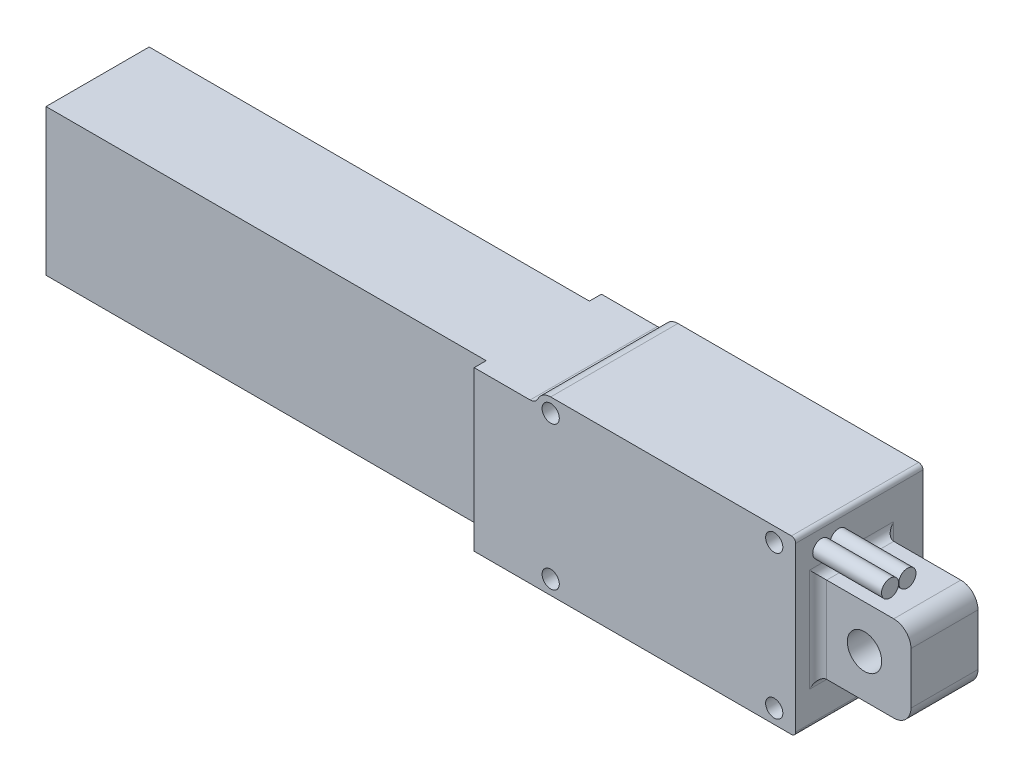
ISO-10303-21;
HEADER;
FILE_DESCRIPTION(('STEP AP214'),'2;1');
FILE_NAME('part.step','',(''),(''),'','','');
FILE_SCHEMA(('AUTOMOTIVE_DESIGN { 1 0 10303 214 1 1 1 1 }'));
ENDSEC;
DATA;
#1=APPLICATION_CONTEXT('core data for automotive mechanical design processes');
#2=APPLICATION_PROTOCOL_DEFINITION('international standard','automotive_design',2000,#1);
#3=PRODUCT_CONTEXT('',#1,'mechanical');
#4=PRODUCT('Part','Part','',(#3));
#5=PRODUCT_RELATED_PRODUCT_CATEGORY('part','',(#4));
#6=PRODUCT_DEFINITION_FORMATION('','',#4);
#7=PRODUCT_DEFINITION_CONTEXT('part definition',#1,'design');
#8=PRODUCT_DEFINITION('design','',#6,#7);
#9=PRODUCT_DEFINITION_SHAPE('','',#8);
#10=(LENGTH_UNIT() NAMED_UNIT(*) SI_UNIT(.MILLI.,.METRE.));
#11=(NAMED_UNIT(*) PLANE_ANGLE_UNIT() SI_UNIT($,.RADIAN.));
#12=(NAMED_UNIT(*) SI_UNIT($,.STERADIAN.) SOLID_ANGLE_UNIT());
#13=UNCERTAINTY_MEASURE_WITH_UNIT(LENGTH_MEASURE(1.E-05),#10,'distance_accuracy_value','');
#14=(GEOMETRIC_REPRESENTATION_CONTEXT(3) GLOBAL_UNCERTAINTY_ASSIGNED_CONTEXT((#13)) GLOBAL_UNIT_ASSIGNED_CONTEXT((#10,
#11,#12)) REPRESENTATION_CONTEXT('',''));
#15=CARTESIAN_POINT('',(0.,0.,0.));
#16=DIRECTION('',(0.,0.,1.));
#17=DIRECTION('',(1.,0.,0.));
#18=AXIS2_PLACEMENT_3D('',#15,#16,#17);
#19=CARTESIAN_POINT('',(-18.7,10.,14.8));
#20=DIRECTION('',(0.,-1.,0.));
#21=DIRECTION('',(0.,0.,-1.));
#22=AXIS2_PLACEMENT_3D('',#19,#20,#21);
#23=PLANE('',#22);
#24=DIRECTION('',(-1.,0.,0.));
#25=VECTOR('',#24,1.);
#26=CARTESIAN_POINT('',(-18.7,10.,14.8));
#27=LINE('',#26,#25);
#28=CARTESIAN_POINT('',(18.2,10.,14.8));
#29=VERTEX_POINT('',#28);
#30=CARTESIAN_POINT('',(-9.8,10.,14.8));
#31=VERTEX_POINT('',#30);
#32=EDGE_CURVE('E342',#29,#31,#27,.T.);
#33=ORIENTED_EDGE('',*,*,#32,.F.);
#34=DIRECTION('',(0.,0.,-1.));
#35=VECTOR('',#34,1.);
#36=CARTESIAN_POINT('',(18.2,10.,14.8));
#37=LINE('',#36,#35);
#38=CARTESIAN_POINT('',(18.2,10.,0.));
#39=VERTEX_POINT('',#38);
#40=EDGE_CURVE('E283',#29,#39,#37,.T.);
#41=ORIENTED_EDGE('',*,*,#40,.T.);
#42=DIRECTION('',(-1.,0.,0.));
#43=VECTOR('',#42,1.);
#44=CARTESIAN_POINT('',(-18.7,10.,0.));
#45=LINE('',#44,#43);
#46=CARTESIAN_POINT('',(-9.8,10.,0.));
#47=VERTEX_POINT('',#46);
#48=EDGE_CURVE('E237',#39,#47,#45,.T.);
#49=ORIENTED_EDGE('',*,*,#48,.T.);
#50=DIRECTION('',(0.,0.,1.));
#51=VECTOR('',#50,1.);
#52=CARTESIAN_POINT('',(-9.8,10.,0.));
#53=LINE('',#52,#51);
#54=EDGE_CURVE('E360',#47,#31,#53,.T.);
#55=ORIENTED_EDGE('',*,*,#54,.T.);
#56=EDGE_LOOP('',(#33,#41,#49,#55));
#57=FACE_BOUND('',#56,.T.);
#58=ADVANCED_FACE('F37',(#57),#23,.F.);
#59=CARTESIAN_POINT('',(19.7,10.,13.2));
#60=DIRECTION('',(0.,1.,0.));
#61=DIRECTION('',(0.,0.,1.));
#62=AXIS2_PLACEMENT_3D('',#59,#60,#61);
#63=CYLINDRICAL_SURFACE('',#62,1.);
#64=DIRECTION('',(0.,1.,0.));
#65=VECTOR('',#64,1.);
#66=CARTESIAN_POINT('',(18.7,10.,13.2));
#67=LINE('',#66,#65);
#68=CARTESIAN_POINT('',(18.7,-6.,13.2));
#69=VERTEX_POINT('',#68);
#70=CARTESIAN_POINT('',(18.7,6.,13.2));
#71=VERTEX_POINT('',#70);
#72=EDGE_CURVE('E259',#69,#71,#67,.T.);
#73=ORIENTED_EDGE('',*,*,#72,.F.);
#74=CARTESIAN_POINT('',(19.7,-6.,13.2));
#75=DIRECTION('',(0.,0.707106781186547,0.707106781186547));
#76=DIRECTION('',(0.,0.707106781186547,-0.707106781186547));
#77=AXIS2_PLACEMENT_3D('',#74,#75,#76);
#78=ELLIPSE('',#77,1.4142135623731,1.);
#79=CARTESIAN_POINT('',(19.7,-5.,12.2));
#80=VERTEX_POINT('',#79);
#81=EDGE_CURVE('E265',#69,#80,#78,.F.);
#82=ORIENTED_EDGE('',*,*,#81,.T.);
#83=DIRECTION('',(0.,1.,0.));
#84=VECTOR('',#83,1.);
#85=CARTESIAN_POINT('',(19.7,0.,12.2));
#86=LINE('',#85,#84);
#87=CARTESIAN_POINT('',(19.7,5.,12.2));
#88=VERTEX_POINT('',#87);
#89=EDGE_CURVE('E262',#88,#80,#86,.F.);
#90=ORIENTED_EDGE('',*,*,#89,.F.);
#91=CARTESIAN_POINT('',(19.7,6.,13.2));
#92=DIRECTION('',(0.,-0.707106781186547,0.707106781186547));
#93=DIRECTION('',(0.,0.707106781186547,0.707106781186547));
#94=AXIS2_PLACEMENT_3D('',#91,#92,#93);
#95=ELLIPSE('',#94,1.4142135623731,1.);
#96=EDGE_CURVE('E267',#88,#71,#95,.F.);
#97=ORIENTED_EDGE('',*,*,#96,.T.);
#98=EDGE_LOOP('',(#73,#82,#90,#97));
#99=FACE_BOUND('',#98,.T.);
#100=ADVANCED_FACE('F313',(#99),#63,.F.);
#101=CARTESIAN_POINT('',(19.7,10.,3.4));
#102=DIRECTION('',(0.,1.,0.));
#103=DIRECTION('',(0.,0.,1.));
#104=AXIS2_PLACEMENT_3D('',#101,#102,#103);
#105=CYLINDRICAL_SURFACE('',#104,1.);
#106=DIRECTION('',(0.,-1.,0.));
#107=VECTOR('',#106,1.);
#108=CARTESIAN_POINT('',(18.7,10.,3.4));
#109=LINE('',#108,#107);
#110=CARTESIAN_POINT('',(18.7,6.,3.4));
#111=VERTEX_POINT('',#110);
#112=CARTESIAN_POINT('',(18.7,-6.,3.4));
#113=VERTEX_POINT('',#112);
#114=EDGE_CURVE('E247',#111,#113,#109,.T.);
#115=ORIENTED_EDGE('',*,*,#114,.F.);
#116=CARTESIAN_POINT('',(19.7,6.,3.4));
#117=DIRECTION('',(0.,0.707106781186547,0.707106781186547));
#118=DIRECTION('',(0.,-0.707106781186547,0.707106781186547));
#119=AXIS2_PLACEMENT_3D('',#116,#117,#118);
#120=ELLIPSE('',#119,1.4142135623731,1.);
#121=CARTESIAN_POINT('',(19.7,5.,4.4));
#122=VERTEX_POINT('',#121);
#123=EDGE_CURVE('E254',#111,#122,#120,.T.);
#124=ORIENTED_EDGE('',*,*,#123,.T.);
#125=DIRECTION('',(0.,-1.,0.));
#126=VECTOR('',#125,1.);
#127=CARTESIAN_POINT('',(19.7,10.,4.4));
#128=LINE('',#127,#126);
#129=CARTESIAN_POINT('',(19.7,-5.,4.4));
#130=VERTEX_POINT('',#129);
#131=EDGE_CURVE('E251',#130,#122,#128,.F.);
#132=ORIENTED_EDGE('',*,*,#131,.F.);
#133=CARTESIAN_POINT('',(19.7,-6.,3.4));
#134=DIRECTION('',(0.,0.707106781186547,-0.707106781186547));
#135=DIRECTION('',(0.,0.707106781186547,0.707106781186547));
#136=AXIS2_PLACEMENT_3D('',#133,#134,#135);
#137=ELLIPSE('',#136,1.4142135623731,1.);
#138=EDGE_CURVE('E256',#130,#113,#137,.F.);
#139=ORIENTED_EDGE('',*,*,#138,.T.);
#140=EDGE_LOOP('',(#115,#124,#132,#139));
#141=FACE_BOUND('',#140,.T.);
#142=ADVANCED_FACE('F512',(#141),#105,.F.);
#143=CARTESIAN_POINT('',(-18.7,10.,14.8));
#144=DIRECTION('',(1.,0.,0.));
#145=DIRECTION('',(0.,1.,0.));
#146=AXIS2_PLACEMENT_3D('',#143,#144,#145);
#147=PLANE('',#146);
#148=DIRECTION('',(0.,-1.,0.));
#149=VECTOR('',#148,1.);
#150=CARTESIAN_POINT('',(-18.7,10.,14.8));
#151=LINE('',#150,#149);
#152=CARTESIAN_POINT('',(-18.7,8.5,14.8));
#153=VERTEX_POINT('',#152);
#154=CARTESIAN_POINT('',(-18.7,-10.,14.8));
#155=VERTEX_POINT('',#154);
#156=EDGE_CURVE('E344',#153,#155,#151,.T.);
#157=ORIENTED_EDGE('',*,*,#156,.F.);
#158=DIRECTION('',(0.,0.,1.));
#159=VECTOR('',#158,1.);
#160=CARTESIAN_POINT('',(-18.7,8.5,0.));
#161=LINE('',#160,#159);
#162=CARTESIAN_POINT('',(-18.7,8.5,13.4));
#163=VERTEX_POINT('',#162);
#164=EDGE_CURVE('E231',#163,#153,#161,.T.);
#165=ORIENTED_EDGE('',*,*,#164,.F.);
#166=DIRECTION('',(0.,1.,0.));
#167=VECTOR('',#166,1.);
#168=CARTESIAN_POINT('',(-18.7,8.5,13.4));
#169=LINE('',#168,#167);
#170=CARTESIAN_POINT('',(-18.7,-8.5,13.4));
#171=VERTEX_POINT('',#170);
#172=EDGE_CURVE('E429',#171,#163,#169,.T.);
#173=ORIENTED_EDGE('',*,*,#172,.F.);
#174=DIRECTION('',(0.,0.,1.));
#175=VECTOR('',#174,1.);
#176=CARTESIAN_POINT('',(-18.7,-8.5,1.4));
#177=LINE('',#176,#175);
#178=CARTESIAN_POINT('',(-18.7,-8.5,1.4));
#179=VERTEX_POINT('',#178);
#180=EDGE_CURVE('E457',#179,#171,#177,.T.);
#181=ORIENTED_EDGE('',*,*,#180,.F.);
#182=DIRECTION('',(0.,1.,0.));
#183=VECTOR('',#182,1.);
#184=CARTESIAN_POINT('',(-18.7,8.5,1.4));
#185=LINE('',#184,#183);
#186=CARTESIAN_POINT('',(-18.7,8.5,1.4));
#187=VERTEX_POINT('',#186);
#188=EDGE_CURVE('E230',#179,#187,#185,.T.);
#189=ORIENTED_EDGE('',*,*,#188,.T.);
#190=CARTESIAN_POINT('',(-18.7,8.5,0.));
#191=VERTEX_POINT('',#190);
#192=EDGE_CURVE('E211',#191,#187,#161,.T.);
#193=ORIENTED_EDGE('',*,*,#192,.F.);
#194=DIRECTION('',(0.,-1.,0.));
#195=VECTOR('',#194,1.);
#196=CARTESIAN_POINT('',(-18.7,10.,0.));
#197=LINE('',#196,#195);
#198=CARTESIAN_POINT('',(-18.7,-10.,0.));
#199=VERTEX_POINT('',#198);
#200=EDGE_CURVE('E227',#191,#199,#197,.T.);
#201=ORIENTED_EDGE('',*,*,#200,.T.);
#202=DIRECTION('',(0.,0.,-1.));
#203=VECTOR('',#202,1.);
#204=CARTESIAN_POINT('',(-18.7,-10.,14.8));
#205=LINE('',#204,#203);
#206=EDGE_CURVE('E245',#155,#199,#205,.T.);
#207=ORIENTED_EDGE('',*,*,#206,.F.);
#208=EDGE_LOOP('',(#157,#165,#173,#181,#189,#193,#201,#207));
#209=FACE_BOUND('',#208,.T.);
#210=ADVANCED_FACE('F225',(#209),#147,.F.);
#211=CARTESIAN_POINT('',(18.7,10.,14.8));
#212=DIRECTION('',(-1.,0.,0.));
#213=DIRECTION('',(0.,0.,1.));
#214=AXIS2_PLACEMENT_3D('',#211,#212,#213);
#215=PLANE('',#214);
#216=CARTESIAN_POINT('',(18.7,7.5,9.81159971838259));
#217=DIRECTION('',(-1.,0.,0.));
#218=DIRECTION('',(0.,0.,1.));
#219=AXIS2_PLACEMENT_3D('',#216,#217,#218);
#220=CIRCLE('',#219,1.);
#221=CARTESIAN_POINT('',(18.7,7.5,10.8115997183826));
#222=VERTEX_POINT('',#221);
#223=EDGE_CURVE('E11',#222,#222,#220,.F.);
#224=ORIENTED_EDGE('',*,*,#223,.F.);
#225=EDGE_LOOP('',(#224));
#226=FACE_BOUND('',#225,.T.);
#227=CARTESIAN_POINT('',(18.7,7.5,11.8215997183826));
#228=DIRECTION('',(-1.,0.,0.));
#229=DIRECTION('',(0.,0.,1.));
#230=AXIS2_PLACEMENT_3D('',#227,#228,#229);
#231=CIRCLE('',#230,1.);
#232=CARTESIAN_POINT('',(18.7,7.5,12.8215997183826));
#233=VERTEX_POINT('',#232);
#234=EDGE_CURVE('E45',#233,#233,#231,.F.);
#235=ORIENTED_EDGE('',*,*,#234,.F.);
#236=EDGE_LOOP('',(#235));
#237=FACE_BOUND('',#236,.T.);
#238=DIRECTION('',(0.,1.,0.));
#239=VECTOR('',#238,1.);
#240=CARTESIAN_POINT('',(18.7,10.,14.8));
#241=LINE('',#240,#239);
#242=CARTESIAN_POINT('',(18.7,-9.5,14.8));
#243=VERTEX_POINT('',#242);
#244=CARTESIAN_POINT('',(18.7,9.5,14.8));
#245=VERTEX_POINT('',#244);
#246=EDGE_CURVE('E239',#243,#245,#241,.T.);
#247=ORIENTED_EDGE('',*,*,#246,.F.);
#248=DIRECTION('',(0.,0.,-1.));
#249=VECTOR('',#248,1.);
#250=CARTESIAN_POINT('',(18.7,-9.5,14.8));
#251=LINE('',#250,#249);
#252=CARTESIAN_POINT('',(18.7,-9.5,0.));
#253=VERTEX_POINT('',#252);
#254=EDGE_CURVE('E272',#243,#253,#251,.T.);
#255=ORIENTED_EDGE('',*,*,#254,.T.);
#256=DIRECTION('',(0.,1.,0.));
#257=VECTOR('',#256,1.);
#258=CARTESIAN_POINT('',(18.7,10.,0.));
#259=LINE('',#258,#257);
#260=CARTESIAN_POINT('',(18.7,9.5,0.));
#261=VERTEX_POINT('',#260);
#262=EDGE_CURVE('E241',#253,#261,#259,.T.);
#263=ORIENTED_EDGE('',*,*,#262,.T.);
#264=DIRECTION('',(0.,0.,-1.));
#265=VECTOR('',#264,1.);
#266=CARTESIAN_POINT('',(18.7,9.5,14.8));
#267=LINE('',#266,#265);
#268=EDGE_CURVE('E270',#261,#245,#267,.F.);
#269=ORIENTED_EDGE('',*,*,#268,.T.);
#270=EDGE_LOOP('',(#247,#255,#263,#269));
#271=FACE_BOUND('',#270,.T.);
#272=DIRECTION('',(0.,0.,1.));
#273=VECTOR('',#272,1.);
#274=CARTESIAN_POINT('',(18.7,-6.,4.4));
#275=LINE('',#274,#273);
#276=EDGE_CURVE('E299',#113,#69,#275,.T.);
#277=ORIENTED_EDGE('',*,*,#276,.T.);
#278=ORIENTED_EDGE('',*,*,#72,.T.);
#279=DIRECTION('',(0.,0.,1.));
#280=VECTOR('',#279,1.);
#281=CARTESIAN_POINT('',(18.7,6.,4.4));
#282=LINE('',#281,#280);
#283=EDGE_CURVE('E321',#111,#71,#282,.T.);
#284=ORIENTED_EDGE('',*,*,#283,.F.);
#285=ORIENTED_EDGE('',*,*,#114,.T.);
#286=EDGE_LOOP('',(#277,#278,#284,#285));
#287=FACE_BOUND('',#286,.T.);
#288=ADVANCED_FACE('F290',(#226,#237,#271,#287),#215,.F.);
#289=CARTESIAN_POINT('',(-18.7,-10.,14.8));
#290=DIRECTION('',(0.,1.,0.));
#291=DIRECTION('',(0.,0.,1.));
#292=AXIS2_PLACEMENT_3D('',#289,#290,#291);
#293=PLANE('',#292);
#294=DIRECTION('',(1.,0.,0.));
#295=VECTOR('',#294,1.);
#296=CARTESIAN_POINT('',(-18.7,-10.,0.));
#297=LINE('',#296,#295);
#298=CARTESIAN_POINT('',(18.2,-10.,0.));
#299=VERTEX_POINT('',#298);
#300=EDGE_CURVE('E236',#199,#299,#297,.T.);
#301=ORIENTED_EDGE('',*,*,#300,.T.);
#302=DIRECTION('',(0.,0.,-1.));
#303=VECTOR('',#302,1.);
#304=CARTESIAN_POINT('',(18.2,-10.,14.8));
#305=LINE('',#304,#303);
#306=CARTESIAN_POINT('',(18.2,-10.,14.8));
#307=VERTEX_POINT('',#306);
#308=EDGE_CURVE('E60',#299,#307,#305,.F.);
#309=ORIENTED_EDGE('',*,*,#308,.T.);
#310=DIRECTION('',(1.,0.,0.));
#311=VECTOR('',#310,1.);
#312=CARTESIAN_POINT('',(-18.7,-10.,14.8));
#313=LINE('',#312,#311);
#314=EDGE_CURVE('E248',#155,#307,#313,.T.);
#315=ORIENTED_EDGE('',*,*,#314,.F.);
#316=ORIENTED_EDGE('',*,*,#206,.T.);
#317=EDGE_LOOP('',(#301,#309,#315,#316));
#318=FACE_BOUND('',#317,.T.);
#319=ADVANCED_FACE('F293',(#318),#293,.F.);
#320=CARTESIAN_POINT('',(0.,0.,14.8));
#321=DIRECTION('',(0.,0.,1.));
#322=DIRECTION('',(1.,0.,0.));
#323=AXIS2_PLACEMENT_3D('',#320,#321,#322);
#324=PLANE('',#323);
#325=CARTESIAN_POINT('',(16.2,-8.35,14.8));
#326=DIRECTION('',(0.,0.,1.));
#327=DIRECTION('',(-1.,0.,0.));
#328=AXIS2_PLACEMENT_3D('',#325,#326,#327);
#329=CIRCLE('',#328,1.);
#330=CARTESIAN_POINT('',(15.2,-8.35,14.8));
#331=VERTEX_POINT('',#330);
#332=EDGE_CURVE('E394',#331,#331,#329,.T.);
#333=ORIENTED_EDGE('',*,*,#332,.F.);
#334=EDGE_LOOP('',(#333));
#335=FACE_BOUND('',#334,.T.);
#336=CARTESIAN_POINT('',(-9.80000000000001,-8.34999999999999,14.8));
#337=DIRECTION('',(0.,0.,1.));
#338=DIRECTION('',(-1.,0.,0.));
#339=AXIS2_PLACEMENT_3D('',#336,#337,#338);
#340=CIRCLE('',#339,1.);
#341=CARTESIAN_POINT('',(-10.8,-8.34999999999999,14.8));
#342=VERTEX_POINT('',#341);
#343=EDGE_CURVE('E388',#342,#342,#340,.T.);
#344=ORIENTED_EDGE('',*,*,#343,.F.);
#345=EDGE_LOOP('',(#344));
#346=FACE_BOUND('',#345,.T.);
#347=CARTESIAN_POINT('',(-9.8,8.34999999999999,14.8));
#348=DIRECTION('',(0.,0.,1.));
#349=DIRECTION('',(1.,0.,0.));
#350=AXIS2_PLACEMENT_3D('',#347,#348,#349);
#351=CIRCLE('',#350,1.);
#352=CARTESIAN_POINT('',(-8.8,8.34999999999999,14.8));
#353=VERTEX_POINT('',#352);
#354=EDGE_CURVE('E376',#353,#353,#351,.T.);
#355=ORIENTED_EDGE('',*,*,#354,.F.);
#356=EDGE_LOOP('',(#355));
#357=FACE_BOUND('',#356,.T.);
#358=ORIENTED_EDGE('',*,*,#314,.T.);
#359=CARTESIAN_POINT('',(18.2,-9.5,14.8));
#360=DIRECTION('',(0.,0.,1.));
#361=DIRECTION('',(1.,0.,0.));
#362=AXIS2_PLACEMENT_3D('',#359,#360,#361);
#363=CIRCLE('',#362,0.5);
#364=EDGE_CURVE('E281',#307,#243,#363,.T.);
#365=ORIENTED_EDGE('',*,*,#364,.T.);
#366=ORIENTED_EDGE('',*,*,#246,.T.);
#367=CARTESIAN_POINT('',(18.2,9.5,14.8));
#368=DIRECTION('',(0.,0.,1.));
#369=DIRECTION('',(1.,0.,0.));
#370=AXIS2_PLACEMENT_3D('',#367,#368,#369);
#371=CIRCLE('',#370,0.5);
#372=EDGE_CURVE('E52',#245,#29,#371,.T.);
#373=ORIENTED_EDGE('',*,*,#372,.T.);
#374=ORIENTED_EDGE('',*,*,#32,.T.);
#375=CARTESIAN_POINT('',(-9.8,8.34999999999999,14.8));
#376=DIRECTION('',(0.,0.,-1.));
#377=DIRECTION('',(1.,0.,0.));
#378=AXIS2_PLACEMENT_3D('',#375,#376,#377);
#379=CIRCLE('',#378,1.65000000000001);
#380=CARTESIAN_POINT('',(-11.286536229239,9.06603773584905,14.8));
#381=VERTEX_POINT('',#380);
#382=EDGE_CURVE('E220',#381,#31,#379,.T.);
#383=ORIENTED_EDGE('',*,*,#382,.F.);
#384=CARTESIAN_POINT('',(-12.1874672772627,9.5,14.8));
#385=DIRECTION('',(0.,0.,1.));
#386=DIRECTION('',(1.,0.,0.));
#387=AXIS2_PLACEMENT_3D('',#384,#385,#386);
#388=CIRCLE('',#387,1.);
#389=CARTESIAN_POINT('',(-12.1874672772627,8.5,14.8));
#390=VERTEX_POINT('',#389);
#391=EDGE_CURVE('E369',#390,#381,#388,.T.);
#392=ORIENTED_EDGE('',*,*,#391,.F.);
#393=DIRECTION('',(1.,0.,0.));
#394=VECTOR('',#393,1.);
#395=CARTESIAN_POINT('',(-18.7,8.5,14.8));
#396=LINE('',#395,#394);
#397=EDGE_CURVE('E371',#153,#390,#396,.T.);
#398=ORIENTED_EDGE('',*,*,#397,.F.);
#399=ORIENTED_EDGE('',*,*,#156,.T.);
#400=EDGE_LOOP('',(#358,#365,#366,#373,#374,#383,#392,#398,#399));
#401=FACE_BOUND('',#400,.T.);
#402=CARTESIAN_POINT('',(16.2,8.35,14.8));
#403=DIRECTION('',(0.,0.,1.));
#404=DIRECTION('',(1.,0.,0.));
#405=AXIS2_PLACEMENT_3D('',#402,#403,#404);
#406=CIRCLE('',#405,1.);
#407=CARTESIAN_POINT('',(17.2,8.35,14.8));
#408=VERTEX_POINT('',#407);
#409=EDGE_CURVE('E382',#408,#408,#406,.T.);
#410=ORIENTED_EDGE('',*,*,#409,.F.);
#411=EDGE_LOOP('',(#410));
#412=FACE_BOUND('',#411,.T.);
#413=ADVANCED_FACE('F347',(#335,#346,#357,#401,#412),#324,.T.);
#414=CARTESIAN_POINT('',(0.,0.,0.));
#415=DIRECTION('',(0.,0.,1.));
#416=DIRECTION('',(1.,0.,0.));
#417=AXIS2_PLACEMENT_3D('',#414,#415,#416);
#418=PLANE('',#417);
#419=CARTESIAN_POINT('',(16.2,-8.35,0.));
#420=DIRECTION('',(0.,0.,1.));
#421=DIRECTION('',(-1.,0.,0.));
#422=AXIS2_PLACEMENT_3D('',#419,#420,#421);
#423=CIRCLE('',#422,1.);
#424=CARTESIAN_POINT('',(15.2,-8.35,0.));
#425=VERTEX_POINT('',#424);
#426=EDGE_CURVE('E391',#425,#425,#423,.T.);
#427=ORIENTED_EDGE('',*,*,#426,.T.);
#428=EDGE_LOOP('',(#427));
#429=FACE_BOUND('',#428,.T.);
#430=CARTESIAN_POINT('',(-9.80000000000001,-8.34999999999999,0.));
#431=DIRECTION('',(0.,0.,1.));
#432=DIRECTION('',(-1.,0.,0.));
#433=AXIS2_PLACEMENT_3D('',#430,#431,#432);
#434=CIRCLE('',#433,1.);
#435=CARTESIAN_POINT('',(-10.8,-8.34999999999999,0.));
#436=VERTEX_POINT('',#435);
#437=EDGE_CURVE('E385',#436,#436,#434,.T.);
#438=ORIENTED_EDGE('',*,*,#437,.T.);
#439=EDGE_LOOP('',(#438));
#440=FACE_BOUND('',#439,.T.);
#441=CARTESIAN_POINT('',(-9.8,8.34999999999999,0.));
#442=DIRECTION('',(0.,0.,1.));
#443=DIRECTION('',(1.,0.,0.));
#444=AXIS2_PLACEMENT_3D('',#441,#442,#443);
#445=CIRCLE('',#444,1.);
#446=CARTESIAN_POINT('',(-8.8,8.34999999999999,0.));
#447=VERTEX_POINT('',#446);
#448=EDGE_CURVE('E379',#447,#447,#445,.T.);
#449=ORIENTED_EDGE('',*,*,#448,.T.);
#450=EDGE_LOOP('',(#449));
#451=FACE_BOUND('',#450,.T.);
#452=CARTESIAN_POINT('',(16.2,8.35,0.));
#453=DIRECTION('',(0.,0.,1.));
#454=DIRECTION('',(1.,0.,0.));
#455=AXIS2_PLACEMENT_3D('',#452,#453,#454);
#456=CIRCLE('',#455,1.);
#457=CARTESIAN_POINT('',(17.2,8.35,0.));
#458=VERTEX_POINT('',#457);
#459=EDGE_CURVE('E398',#458,#458,#456,.T.);
#460=ORIENTED_EDGE('',*,*,#459,.T.);
#461=EDGE_LOOP('',(#460));
#462=FACE_BOUND('',#461,.T.);
#463=ORIENTED_EDGE('',*,*,#262,.F.);
#464=CARTESIAN_POINT('',(18.2,-9.5,0.));
#465=DIRECTION('',(0.,0.,1.));
#466=DIRECTION('',(1.,0.,0.));
#467=AXIS2_PLACEMENT_3D('',#464,#465,#466);
#468=CIRCLE('',#467,0.5);
#469=EDGE_CURVE('E277',#253,#299,#468,.F.);
#470=ORIENTED_EDGE('',*,*,#469,.T.);
#471=ORIENTED_EDGE('',*,*,#300,.F.);
#472=ORIENTED_EDGE('',*,*,#200,.F.);
#473=DIRECTION('',(1.,0.,0.));
#474=VECTOR('',#473,1.);
#475=CARTESIAN_POINT('',(-18.7,8.5,0.));
#476=LINE('',#475,#474);
#477=CARTESIAN_POINT('',(-12.1874672772627,8.5,0.));
#478=VERTEX_POINT('',#477);
#479=EDGE_CURVE('E206',#191,#478,#476,.T.);
#480=ORIENTED_EDGE('',*,*,#479,.T.);
#481=CARTESIAN_POINT('',(-12.1874672772627,9.5,0.));
#482=DIRECTION('',(0.,0.,1.));
#483=DIRECTION('',(1.,0.,0.));
#484=AXIS2_PLACEMENT_3D('',#481,#482,#483);
#485=CIRCLE('',#484,1.);
#486=CARTESIAN_POINT('',(-11.286536229239,9.06603773584905,0.));
#487=VERTEX_POINT('',#486);
#488=EDGE_CURVE('E219',#478,#487,#485,.T.);
#489=ORIENTED_EDGE('',*,*,#488,.T.);
#490=CARTESIAN_POINT('',(-9.8,8.34999999999999,0.));
#491=DIRECTION('',(0.,0.,-1.));
#492=DIRECTION('',(1.,0.,0.));
#493=AXIS2_PLACEMENT_3D('',#490,#491,#492);
#494=CIRCLE('',#493,1.65000000000001);
#495=EDGE_CURVE('E829',#487,#47,#494,.T.);
#496=ORIENTED_EDGE('',*,*,#495,.T.);
#497=ORIENTED_EDGE('',*,*,#48,.F.);
#498=CARTESIAN_POINT('',(18.2,9.5,0.));
#499=DIRECTION('',(0.,0.,1.));
#500=DIRECTION('',(1.,0.,0.));
#501=AXIS2_PLACEMENT_3D('',#498,#499,#500);
#502=CIRCLE('',#501,0.5);
#503=EDGE_CURVE('E275',#39,#261,#502,.F.);
#504=ORIENTED_EDGE('',*,*,#503,.T.);
#505=EDGE_LOOP('',(#463,#470,#471,#472,#480,#489,#496,#497,#504));
#506=FACE_BOUND('',#505,.T.);
#507=ADVANCED_FACE('F235',(#429,#440,#451,#462,#506),#418,.F.);
#508=CARTESIAN_POINT('',(19.7,6.,4.4));
#509=DIRECTION('',(0.,0.,1.));
#510=DIRECTION('',(1.,0.,0.));
#511=AXIS2_PLACEMENT_3D('',#508,#509,#510);
#512=CYLINDRICAL_SURFACE('',#511,1.);
#513=ORIENTED_EDGE('',*,*,#283,.T.);
#514=ORIENTED_EDGE('',*,*,#96,.F.);
#515=DIRECTION('',(0.,0.,1.));
#516=VECTOR('',#515,1.);
#517=CARTESIAN_POINT('',(19.7,5.,4.4));
#518=LINE('',#517,#516);
#519=EDGE_CURVE('E319',#122,#88,#518,.T.);
#520=ORIENTED_EDGE('',*,*,#519,.F.);
#521=ORIENTED_EDGE('',*,*,#123,.F.);
#522=EDGE_LOOP('',(#513,#514,#520,#521));
#523=FACE_BOUND('',#522,.T.);
#524=ADVANCED_FACE('F317',(#523),#512,.F.);
#525=CARTESIAN_POINT('',(0.,5.,4.4));
#526=DIRECTION('',(0.,-1.,0.));
#527=DIRECTION('',(0.,0.,-1.));
#528=AXIS2_PLACEMENT_3D('',#525,#526,#527);
#529=PLANE('',#528);
#530=DIRECTION('',(1.,0.,0.));
#531=VECTOR('',#530,1.);
#532=CARTESIAN_POINT('',(0.,5.,12.2));
#533=LINE('',#532,#531);
#534=CARTESIAN_POINT('',(27.5,5.,12.2));
#535=VERTEX_POINT('',#534);
#536=EDGE_CURVE('E327',#88,#535,#533,.T.);
#537=ORIENTED_EDGE('',*,*,#536,.T.);
#538=DIRECTION('',(0.,0.,1.));
#539=VECTOR('',#538,1.);
#540=CARTESIAN_POINT('',(27.5,5.,4.4));
#541=LINE('',#540,#539);
#542=CARTESIAN_POINT('',(27.5,5.,4.4));
#543=VERTEX_POINT('',#542);
#544=EDGE_CURVE('E324',#543,#535,#541,.T.);
#545=ORIENTED_EDGE('',*,*,#544,.F.);
#546=DIRECTION('',(1.,0.,0.));
#547=VECTOR('',#546,1.);
#548=CARTESIAN_POINT('',(0.,5.,4.4));
#549=LINE('',#548,#547);
#550=EDGE_CURVE('E305',#122,#543,#549,.T.);
#551=ORIENTED_EDGE('',*,*,#550,.F.);
#552=ORIENTED_EDGE('',*,*,#519,.T.);
#553=EDGE_LOOP('',(#537,#545,#551,#552));
#554=FACE_BOUND('',#553,.T.);
#555=ADVANCED_FACE('F492',(#554),#529,.F.);
#556=CARTESIAN_POINT('',(27.5,3.,4.4));
#557=DIRECTION('',(0.,0.,1.));
#558=DIRECTION('',(1.,0.,0.));
#559=AXIS2_PLACEMENT_3D('',#556,#557,#558);
#560=CYLINDRICAL_SURFACE('',#559,2.);
#561=CARTESIAN_POINT('',(27.5,3.,12.2));
#562=DIRECTION('',(0.,0.,1.));
#563=DIRECTION('',(1.,0.,0.));
#564=AXIS2_PLACEMENT_3D('',#561,#562,#563);
#565=CIRCLE('',#564,2.);
#566=CARTESIAN_POINT('',(29.5,3.,12.2));
#567=VERTEX_POINT('',#566);
#568=EDGE_CURVE('E485',#535,#567,#565,.F.);
#569=ORIENTED_EDGE('',*,*,#568,.T.);
#570=DIRECTION('',(0.,0.,1.));
#571=VECTOR('',#570,1.);
#572=CARTESIAN_POINT('',(29.5,3.,4.4));
#573=LINE('',#572,#571);
#574=CARTESIAN_POINT('',(29.5,3.,4.4));
#575=VERTEX_POINT('',#574);
#576=EDGE_CURVE('E332',#575,#567,#573,.T.);
#577=ORIENTED_EDGE('',*,*,#576,.F.);
#578=CARTESIAN_POINT('',(27.5,3.,4.4));
#579=DIRECTION('',(0.,0.,1.));
#580=DIRECTION('',(1.,0.,0.));
#581=AXIS2_PLACEMENT_3D('',#578,#579,#580);
#582=CIRCLE('',#581,2.);
#583=EDGE_CURVE('E473',#543,#575,#582,.F.);
#584=ORIENTED_EDGE('',*,*,#583,.F.);
#585=ORIENTED_EDGE('',*,*,#544,.T.);
#586=EDGE_LOOP('',(#569,#577,#584,#585));
#587=FACE_BOUND('',#586,.T.);
#588=ADVANCED_FACE('F495',(#587),#560,.T.);
#589=CARTESIAN_POINT('',(29.5,0.,4.4));
#590=DIRECTION('',(-1.,0.,0.));
#591=DIRECTION('',(0.,0.,1.));
#592=AXIS2_PLACEMENT_3D('',#589,#590,#591);
#593=PLANE('',#592);
#594=DIRECTION('',(0.,-1.,0.));
#595=VECTOR('',#594,1.);
#596=CARTESIAN_POINT('',(29.5,0.,12.2));
#597=LINE('',#596,#595);
#598=CARTESIAN_POINT('',(29.5,-3.,12.2));
#599=VERTEX_POINT('',#598);
#600=EDGE_CURVE('E484',#567,#599,#597,.T.);
#601=ORIENTED_EDGE('',*,*,#600,.T.);
#602=DIRECTION('',(0.,0.,1.));
#603=VECTOR('',#602,1.);
#604=CARTESIAN_POINT('',(29.5,-3.,4.4));
#605=LINE('',#604,#603);
#606=CARTESIAN_POINT('',(29.5,-3.,4.4));
#607=VERTEX_POINT('',#606);
#608=EDGE_CURVE('E335',#607,#599,#605,.T.);
#609=ORIENTED_EDGE('',*,*,#608,.F.);
#610=DIRECTION('',(0.,-1.,0.));
#611=VECTOR('',#610,1.);
#612=CARTESIAN_POINT('',(29.5,0.,4.4));
#613=LINE('',#612,#611);
#614=EDGE_CURVE('E471',#575,#607,#613,.T.);
#615=ORIENTED_EDGE('',*,*,#614,.F.);
#616=ORIENTED_EDGE('',*,*,#576,.T.);
#617=EDGE_LOOP('',(#601,#609,#615,#616));
#618=FACE_BOUND('',#617,.T.);
#619=ADVANCED_FACE('F501',(#618),#593,.F.);
#620=CARTESIAN_POINT('',(27.5,-3.,4.4));
#621=DIRECTION('',(0.,0.,1.));
#622=DIRECTION('',(1.,0.,0.));
#623=AXIS2_PLACEMENT_3D('',#620,#621,#622);
#624=CYLINDRICAL_SURFACE('',#623,2.);
#625=CARTESIAN_POINT('',(27.5,-3.,12.2));
#626=DIRECTION('',(0.,0.,1.));
#627=DIRECTION('',(1.,0.,0.));
#628=AXIS2_PLACEMENT_3D('',#625,#626,#627);
#629=CIRCLE('',#628,2.);
#630=CARTESIAN_POINT('',(27.5,-5.,12.2));
#631=VERTEX_POINT('',#630);
#632=EDGE_CURVE('E481',#599,#631,#629,.F.);
#633=ORIENTED_EDGE('',*,*,#632,.T.);
#634=DIRECTION('',(0.,0.,1.));
#635=VECTOR('',#634,1.);
#636=CARTESIAN_POINT('',(27.5,-5.,4.4));
#637=LINE('',#636,#635);
#638=CARTESIAN_POINT('',(27.5,-5.,4.4));
#639=VERTEX_POINT('',#638);
#640=EDGE_CURVE('E338',#639,#631,#637,.T.);
#641=ORIENTED_EDGE('',*,*,#640,.F.);
#642=CARTESIAN_POINT('',(27.5,-3.,4.4));
#643=DIRECTION('',(0.,0.,1.));
#644=DIRECTION('',(1.,0.,0.));
#645=AXIS2_PLACEMENT_3D('',#642,#643,#644);
#646=CIRCLE('',#645,2.);
#647=EDGE_CURVE('E469',#607,#639,#646,.F.);
#648=ORIENTED_EDGE('',*,*,#647,.F.);
#649=ORIENTED_EDGE('',*,*,#608,.T.);
#650=EDGE_LOOP('',(#633,#641,#648,#649));
#651=FACE_BOUND('',#650,.T.);
#652=ADVANCED_FACE('F505',(#651),#624,.T.);
#653=CARTESIAN_POINT('',(0.,-5.,4.4));
#654=DIRECTION('',(0.,-1.,0.));
#655=DIRECTION('',(0.,0.,-1.));
#656=AXIS2_PLACEMENT_3D('',#653,#654,#655);
#657=PLANE('',#656);
#658=DIRECTION('',(1.,0.,0.));
#659=VECTOR('',#658,1.);
#660=CARTESIAN_POINT('',(0.,-5.,12.2));
#661=LINE('',#660,#659);
#662=EDGE_CURVE('E478',#80,#631,#661,.T.);
#663=ORIENTED_EDGE('',*,*,#662,.F.);
#664=DIRECTION('',(0.,0.,1.));
#665=VECTOR('',#664,1.);
#666=CARTESIAN_POINT('',(19.7,-5.,4.4));
#667=LINE('',#666,#665);
#668=EDGE_CURVE('E304',#130,#80,#667,.T.);
#669=ORIENTED_EDGE('',*,*,#668,.F.);
#670=DIRECTION('',(1.,0.,0.));
#671=VECTOR('',#670,1.);
#672=CARTESIAN_POINT('',(0.,-5.,4.4));
#673=LINE('',#672,#671);
#674=EDGE_CURVE('E466',#130,#639,#673,.T.);
#675=ORIENTED_EDGE('',*,*,#674,.T.);
#676=ORIENTED_EDGE('',*,*,#640,.T.);
#677=EDGE_LOOP('',(#663,#669,#675,#676));
#678=FACE_BOUND('',#677,.T.);
#679=ADVANCED_FACE('F514',(#678),#657,.T.);
#680=CARTESIAN_POINT('',(24.1,0.,4.4));
#681=DIRECTION('',(0.,0.,1.));
#682=DIRECTION('',(1.,0.,0.));
#683=AXIS2_PLACEMENT_3D('',#680,#681,#682);
#684=CYLINDRICAL_SURFACE('',#683,2.);
#685=CARTESIAN_POINT('',(24.1,0.,4.4));
#686=DIRECTION('',(0.,0.,1.));
#687=DIRECTION('',(1.,0.,0.));
#688=AXIS2_PLACEMENT_3D('',#685,#686,#687);
#689=CIRCLE('',#688,2.);
#690=CARTESIAN_POINT('',(26.1,0.,4.4));
#691=VERTEX_POINT('',#690);
#692=EDGE_CURVE('E463',#691,#691,#689,.T.);
#693=ORIENTED_EDGE('',*,*,#692,.F.);
#694=EDGE_LOOP('',(#693));
#695=FACE_BOUND('',#694,.T.);
#696=CARTESIAN_POINT('',(24.1,0.,12.2));
#697=DIRECTION('',(0.,0.,1.));
#698=DIRECTION('',(1.,0.,0.));
#699=AXIS2_PLACEMENT_3D('',#696,#697,#698);
#700=CIRCLE('',#699,2.);
#701=CARTESIAN_POINT('',(26.1,0.,12.2));
#702=VERTEX_POINT('',#701);
#703=EDGE_CURVE('E459',#702,#702,#700,.T.);
#704=ORIENTED_EDGE('',*,*,#703,.T.);
#705=EDGE_LOOP('',(#704));
#706=FACE_BOUND('',#705,.T.);
#707=ADVANCED_FACE('F516',(#695,#706),#684,.F.);
#708=CARTESIAN_POINT('',(19.7,-6.,4.4));
#709=DIRECTION('',(0.,0.,1.));
#710=DIRECTION('',(1.,0.,0.));
#711=AXIS2_PLACEMENT_3D('',#708,#709,#710);
#712=CYLINDRICAL_SURFACE('',#711,1.);
#713=ORIENTED_EDGE('',*,*,#668,.T.);
#714=ORIENTED_EDGE('',*,*,#81,.F.);
#715=ORIENTED_EDGE('',*,*,#276,.F.);
#716=ORIENTED_EDGE('',*,*,#138,.F.);
#717=EDGE_LOOP('',(#713,#714,#715,#716));
#718=FACE_BOUND('',#717,.T.);
#719=ADVANCED_FACE('F308',(#718),#712,.F.);
#720=CARTESIAN_POINT('',(0.,0.,4.4));
#721=DIRECTION('',(0.,0.,1.));
#722=DIRECTION('',(1.,0.,0.));
#723=AXIS2_PLACEMENT_3D('',#720,#721,#722);
#724=PLANE('',#723);
#725=ORIENTED_EDGE('',*,*,#692,.T.);
#726=EDGE_LOOP('',(#725));
#727=FACE_BOUND('',#726,.T.);
#728=ORIENTED_EDGE('',*,*,#674,.F.);
#729=ORIENTED_EDGE('',*,*,#131,.T.);
#730=ORIENTED_EDGE('',*,*,#550,.T.);
#731=ORIENTED_EDGE('',*,*,#583,.T.);
#732=ORIENTED_EDGE('',*,*,#614,.T.);
#733=ORIENTED_EDGE('',*,*,#647,.T.);
#734=EDGE_LOOP('',(#728,#729,#730,#731,#732,#733));
#735=FACE_BOUND('',#734,.T.);
#736=ADVANCED_FACE('F509',(#727,#735),#724,.F.);
#737=CARTESIAN_POINT('',(0.,0.,12.2));
#738=DIRECTION('',(0.,0.,1.));
#739=DIRECTION('',(1.,0.,0.));
#740=AXIS2_PLACEMENT_3D('',#737,#738,#739);
#741=PLANE('',#740);
#742=ORIENTED_EDGE('',*,*,#703,.F.);
#743=EDGE_LOOP('',(#742));
#744=FACE_BOUND('',#743,.T.);
#745=ORIENTED_EDGE('',*,*,#536,.F.);
#746=ORIENTED_EDGE('',*,*,#89,.T.);
#747=ORIENTED_EDGE('',*,*,#662,.T.);
#748=ORIENTED_EDGE('',*,*,#632,.F.);
#749=ORIENTED_EDGE('',*,*,#600,.F.);
#750=ORIENTED_EDGE('',*,*,#568,.F.);
#751=EDGE_LOOP('',(#745,#746,#747,#748,#749,#750));
#752=FACE_BOUND('',#751,.T.);
#753=ADVANCED_FACE('F497',(#744,#752),#741,.T.);
#754=CARTESIAN_POINT('',(-69.9,-8.5,1.4));
#755=DIRECTION('',(0.,-1.,0.));
#756=DIRECTION('',(1.,0.,0.));
#757=AXIS2_PLACEMENT_3D('',#754,#755,#756);
#758=PLANE('',#757);
#759=DIRECTION('',(1.,0.,0.));
#760=VECTOR('',#759,1.);
#761=CARTESIAN_POINT('',(-69.9,-8.5,13.4));
#762=LINE('',#761,#760);
#763=CARTESIAN_POINT('',(-69.9,-8.5,13.4));
#764=VERTEX_POINT('',#763);
#765=EDGE_CURVE('E438',#764,#171,#762,.T.);
#766=ORIENTED_EDGE('',*,*,#765,.F.);
#767=DIRECTION('',(0.,0.,1.));
#768=VECTOR('',#767,1.);
#769=CARTESIAN_POINT('',(-69.9,-8.5,1.4));
#770=LINE('',#769,#768);
#771=CARTESIAN_POINT('',(-69.9,-8.5,1.4));
#772=VERTEX_POINT('',#771);
#773=EDGE_CURVE('E460',#772,#764,#770,.T.);
#774=ORIENTED_EDGE('',*,*,#773,.F.);
#775=DIRECTION('',(1.,0.,0.));
#776=VECTOR('',#775,1.);
#777=CARTESIAN_POINT('',(-69.9,-8.5,1.4));
#778=LINE('',#777,#776);
#779=EDGE_CURVE('E443',#772,#179,#778,.T.);
#780=ORIENTED_EDGE('',*,*,#779,.T.);
#781=ORIENTED_EDGE('',*,*,#180,.T.);
#782=EDGE_LOOP('',(#766,#774,#780,#781));
#783=FACE_BOUND('',#782,.T.);
#784=ADVANCED_FACE('F588',(#783),#758,.T.);
#785=CARTESIAN_POINT('',(-69.9,8.5,1.4));
#786=DIRECTION('',(-1.,0.,0.));
#787=DIRECTION('',(0.,0.,1.));
#788=AXIS2_PLACEMENT_3D('',#785,#786,#787);
#789=PLANE('',#788);
#790=DIRECTION('',(0.,1.,0.));
#791=VECTOR('',#790,1.);
#792=CARTESIAN_POINT('',(-69.9,4.5,11.9));
#793=LINE('',#792,#791);
#794=CARTESIAN_POINT('',(-69.9,-4.5,11.9));
#795=VERTEX_POINT('',#794);
#796=CARTESIAN_POINT('',(-69.9,4.5,11.9));
#797=VERTEX_POINT('',#796);
#798=EDGE_CURVE('E401',#795,#797,#793,.T.);
#799=ORIENTED_EDGE('',*,*,#798,.F.);
#800=DIRECTION('',(0.,0.,1.));
#801=VECTOR('',#800,1.);
#802=CARTESIAN_POINT('',(-69.9,-4.5,2.9));
#803=LINE('',#802,#801);
#804=CARTESIAN_POINT('',(-69.9,-4.5,2.9));
#805=VERTEX_POINT('',#804);
#806=EDGE_CURVE('E408',#805,#795,#803,.T.);
#807=ORIENTED_EDGE('',*,*,#806,.F.);
#808=DIRECTION('',(0.,-1.,0.));
#809=VECTOR('',#808,1.);
#810=CARTESIAN_POINT('',(-69.9,4.5,2.9));
#811=LINE('',#810,#809);
#812=CARTESIAN_POINT('',(-69.9,4.5,2.9));
#813=VERTEX_POINT('',#812);
#814=EDGE_CURVE('E422',#813,#805,#811,.T.);
#815=ORIENTED_EDGE('',*,*,#814,.F.);
#816=DIRECTION('',(0.,0.,-1.));
#817=VECTOR('',#816,1.);
#818=CARTESIAN_POINT('',(-69.9,4.5,2.9));
#819=LINE('',#818,#817);
#820=EDGE_CURVE('E419',#797,#813,#819,.T.);
#821=ORIENTED_EDGE('',*,*,#820,.F.);
#822=EDGE_LOOP('',(#799,#807,#815,#821));
#823=FACE_BOUND('',#822,.T.);
#824=DIRECTION('',(0.,-1.,0.));
#825=VECTOR('',#824,1.);
#826=CARTESIAN_POINT('',(-69.9,8.5,13.4));
#827=LINE('',#826,#825);
#828=CARTESIAN_POINT('',(-69.9,8.5,13.4));
#829=VERTEX_POINT('',#828);
#830=EDGE_CURVE('E452',#829,#764,#827,.T.);
#831=ORIENTED_EDGE('',*,*,#830,.F.);
#832=DIRECTION('',(0.,0.,1.));
#833=VECTOR('',#832,1.);
#834=CARTESIAN_POINT('',(-69.9,8.5,1.4));
#835=LINE('',#834,#833);
#836=CARTESIAN_POINT('',(-69.9,8.5,1.4));
#837=VERTEX_POINT('',#836);
#838=EDGE_CURVE('E446',#837,#829,#835,.T.);
#839=ORIENTED_EDGE('',*,*,#838,.F.);
#840=DIRECTION('',(0.,-1.,0.));
#841=VECTOR('',#840,1.);
#842=CARTESIAN_POINT('',(-69.9,8.5,1.4));
#843=LINE('',#842,#841);
#844=EDGE_CURVE('E440',#837,#772,#843,.T.);
#845=ORIENTED_EDGE('',*,*,#844,.T.);
#846=ORIENTED_EDGE('',*,*,#773,.T.);
#847=EDGE_LOOP('',(#831,#839,#845,#846));
#848=FACE_BOUND('',#847,.T.);
#849=ADVANCED_FACE('F591',(#823,#848),#789,.T.);
#850=CARTESIAN_POINT('',(-69.9,8.5,1.4));
#851=DIRECTION('',(0.,1.,0.));
#852=DIRECTION('',(0.,0.,1.));
#853=AXIS2_PLACEMENT_3D('',#850,#851,#852);
#854=PLANE('',#853);
#855=DIRECTION('',(-1.,0.,0.));
#856=VECTOR('',#855,1.);
#857=CARTESIAN_POINT('',(-69.9,8.5,13.4));
#858=LINE('',#857,#856);
#859=EDGE_CURVE('E449',#163,#829,#858,.T.);
#860=ORIENTED_EDGE('',*,*,#859,.F.);
#861=ORIENTED_EDGE('',*,*,#164,.T.);
#862=ORIENTED_EDGE('',*,*,#397,.T.);
#863=DIRECTION('',(0.,0.,1.));
#864=VECTOR('',#863,1.);
#865=CARTESIAN_POINT('',(-12.1874672772627,8.5,0.));
#866=LINE('',#865,#864);
#867=EDGE_CURVE('E214',#478,#390,#866,.T.);
#868=ORIENTED_EDGE('',*,*,#867,.F.);
#869=ORIENTED_EDGE('',*,*,#479,.F.);
#870=ORIENTED_EDGE('',*,*,#192,.T.);
#871=DIRECTION('',(-1.,0.,0.));
#872=VECTOR('',#871,1.);
#873=CARTESIAN_POINT('',(-69.9,8.5,1.4));
#874=LINE('',#873,#872);
#875=EDGE_CURVE('E437',#187,#837,#874,.T.);
#876=ORIENTED_EDGE('',*,*,#875,.T.);
#877=ORIENTED_EDGE('',*,*,#838,.T.);
#878=EDGE_LOOP('',(#860,#861,#862,#868,#869,#870,#876,#877));
#879=FACE_BOUND('',#878,.T.);
#880=ADVANCED_FACE('F209',(#879),#854,.T.);
#881=CARTESIAN_POINT('',(0.,0.,1.4));
#882=DIRECTION('',(0.,0.,1.));
#883=DIRECTION('',(1.,0.,0.));
#884=AXIS2_PLACEMENT_3D('',#881,#882,#883);
#885=PLANE('',#884);
#886=ORIENTED_EDGE('',*,*,#188,.F.);
#887=ORIENTED_EDGE('',*,*,#779,.F.);
#888=ORIENTED_EDGE('',*,*,#844,.F.);
#889=ORIENTED_EDGE('',*,*,#875,.F.);
#890=EDGE_LOOP('',(#886,#887,#888,#889));
#891=FACE_BOUND('',#890,.T.);
#892=ADVANCED_FACE('F581',(#891),#885,.F.);
#893=CARTESIAN_POINT('',(0.,0.,13.4));
#894=DIRECTION('',(0.,0.,1.));
#895=DIRECTION('',(1.,0.,0.));
#896=AXIS2_PLACEMENT_3D('',#893,#894,#895);
#897=PLANE('',#896);
#898=ORIENTED_EDGE('',*,*,#172,.T.);
#899=ORIENTED_EDGE('',*,*,#859,.T.);
#900=ORIENTED_EDGE('',*,*,#830,.T.);
#901=ORIENTED_EDGE('',*,*,#765,.T.);
#902=EDGE_LOOP('',(#898,#899,#900,#901));
#903=FACE_BOUND('',#902,.T.);
#904=ADVANCED_FACE('F579',(#903),#897,.T.);
#905=CARTESIAN_POINT('',(-19.9,4.5,11.9));
#906=DIRECTION('',(0.,0.,1.));
#907=DIRECTION('',(0.,-1.,0.));
#908=AXIS2_PLACEMENT_3D('',#905,#906,#907);
#909=PLANE('',#908);
#910=ORIENTED_EDGE('',*,*,#798,.T.);
#911=DIRECTION('',(-1.,0.,0.));
#912=VECTOR('',#911,1.);
#913=CARTESIAN_POINT('',(-19.9,4.5,11.9));
#914=LINE('',#913,#912);
#915=CARTESIAN_POINT('',(-19.9,4.5,11.9));
#916=VERTEX_POINT('',#915);
#917=EDGE_CURVE('E417',#916,#797,#914,.T.);
#918=ORIENTED_EDGE('',*,*,#917,.F.);
#919=DIRECTION('',(0.,1.,0.));
#920=VECTOR('',#919,1.);
#921=CARTESIAN_POINT('',(-19.9,4.5,11.9));
#922=LINE('',#921,#920);
#923=CARTESIAN_POINT('',(-19.9,-4.5,11.9));
#924=VERTEX_POINT('',#923);
#925=EDGE_CURVE('E404',#924,#916,#922,.T.);
#926=ORIENTED_EDGE('',*,*,#925,.F.);
#927=DIRECTION('',(-1.,0.,0.));
#928=VECTOR('',#927,1.);
#929=CARTESIAN_POINT('',(-19.9,-4.5,11.9));
#930=LINE('',#929,#928);
#931=EDGE_CURVE('E427',#924,#795,#930,.T.);
#932=ORIENTED_EDGE('',*,*,#931,.T.);
#933=EDGE_LOOP('',(#910,#918,#926,#932));
#934=FACE_BOUND('',#933,.T.);
#935=ADVANCED_FACE('F569',(#934),#909,.F.);
#936=CARTESIAN_POINT('',(-19.9,-4.5,2.9));
#937=DIRECTION('',(0.,-1.,0.));
#938=DIRECTION('',(0.,0.,-1.));
#939=AXIS2_PLACEMENT_3D('',#936,#937,#938);
#940=PLANE('',#939);
#941=ORIENTED_EDGE('',*,*,#806,.T.);
#942=ORIENTED_EDGE('',*,*,#931,.F.);
#943=DIRECTION('',(0.,0.,1.));
#944=VECTOR('',#943,1.);
#945=CARTESIAN_POINT('',(-19.9,-4.5,2.9));
#946=LINE('',#945,#944);
#947=CARTESIAN_POINT('',(-19.9,-4.5,2.9));
#948=VERTEX_POINT('',#947);
#949=EDGE_CURVE('E414',#948,#924,#946,.T.);
#950=ORIENTED_EDGE('',*,*,#949,.F.);
#951=DIRECTION('',(-1.,0.,0.));
#952=VECTOR('',#951,1.);
#953=CARTESIAN_POINT('',(-19.9,-4.5,2.9));
#954=LINE('',#953,#952);
#955=EDGE_CURVE('E430',#948,#805,#954,.T.);
#956=ORIENTED_EDGE('',*,*,#955,.T.);
#957=EDGE_LOOP('',(#941,#942,#950,#956));
#958=FACE_BOUND('',#957,.T.);
#959=ADVANCED_FACE('F565',(#958),#940,.F.);
#960=CARTESIAN_POINT('',(-19.9,4.5,2.9));
#961=DIRECTION('',(0.,0.,-1.));
#962=DIRECTION('',(0.,1.,0.));
#963=AXIS2_PLACEMENT_3D('',#960,#961,#962);
#964=PLANE('',#963);
#965=ORIENTED_EDGE('',*,*,#814,.T.);
#966=ORIENTED_EDGE('',*,*,#955,.F.);
#967=DIRECTION('',(0.,-1.,0.));
#968=VECTOR('',#967,1.);
#969=CARTESIAN_POINT('',(-19.9,4.5,2.9));
#970=LINE('',#969,#968);
#971=CARTESIAN_POINT('',(-19.9,4.5,2.9));
#972=VERTEX_POINT('',#971);
#973=EDGE_CURVE('E411',#972,#948,#970,.T.);
#974=ORIENTED_EDGE('',*,*,#973,.F.);
#975=DIRECTION('',(-1.,0.,0.));
#976=VECTOR('',#975,1.);
#977=CARTESIAN_POINT('',(-19.9,4.5,2.9));
#978=LINE('',#977,#976);
#979=EDGE_CURVE('E432',#972,#813,#978,.T.);
#980=ORIENTED_EDGE('',*,*,#979,.T.);
#981=EDGE_LOOP('',(#965,#966,#974,#980));
#982=FACE_BOUND('',#981,.T.);
#983=ADVANCED_FACE('F568',(#982),#964,.F.);
#984=CARTESIAN_POINT('',(-19.9,4.5,2.9));
#985=DIRECTION('',(0.,1.,0.));
#986=DIRECTION('',(0.,0.,1.));
#987=AXIS2_PLACEMENT_3D('',#984,#985,#986);
#988=PLANE('',#987);
#989=ORIENTED_EDGE('',*,*,#820,.T.);
#990=ORIENTED_EDGE('',*,*,#979,.F.);
#991=DIRECTION('',(0.,0.,-1.));
#992=VECTOR('',#991,1.);
#993=CARTESIAN_POINT('',(-19.9,4.5,2.9));
#994=LINE('',#993,#992);
#995=EDGE_CURVE('E407',#916,#972,#994,.T.);
#996=ORIENTED_EDGE('',*,*,#995,.F.);
#997=ORIENTED_EDGE('',*,*,#917,.T.);
#998=EDGE_LOOP('',(#989,#990,#996,#997));
#999=FACE_BOUND('',#998,.T.);
#1000=ADVANCED_FACE('F563',(#999),#988,.F.);
#1001=CARTESIAN_POINT('',(-19.9,0.,0.));
#1002=DIRECTION('',(-1.,0.,0.));
#1003=DIRECTION('',(0.,0.,1.));
#1004=AXIS2_PLACEMENT_3D('',#1001,#1002,#1003);
#1005=PLANE('',#1004);
#1006=ORIENTED_EDGE('',*,*,#925,.T.);
#1007=ORIENTED_EDGE('',*,*,#995,.T.);
#1008=ORIENTED_EDGE('',*,*,#973,.T.);
#1009=ORIENTED_EDGE('',*,*,#949,.T.);
#1010=EDGE_LOOP('',(#1006,#1007,#1008,#1009));
#1011=FACE_BOUND('',#1010,.T.);
#1012=ADVANCED_FACE('F560',(#1011),#1005,.T.);
#1013=CARTESIAN_POINT('',(-9.8,8.34999999999999,0.));
#1014=DIRECTION('',(0.,0.,1.));
#1015=DIRECTION('',(1.,0.,0.));
#1016=AXIS2_PLACEMENT_3D('',#1013,#1014,#1015);
#1017=CYLINDRICAL_SURFACE('',#1016,1.65000000000001);
#1018=ORIENTED_EDGE('',*,*,#382,.T.);
#1019=ORIENTED_EDGE('',*,*,#54,.F.);
#1020=ORIENTED_EDGE('',*,*,#495,.F.);
#1021=DIRECTION('',(0.,0.,1.));
#1022=VECTOR('',#1021,1.);
#1023=CARTESIAN_POINT('',(-11.286536229239,9.06603773584905,0.));
#1024=LINE('',#1023,#1022);
#1025=EDGE_CURVE('E367',#487,#381,#1024,.T.);
#1026=ORIENTED_EDGE('',*,*,#1025,.T.);
#1027=EDGE_LOOP('',(#1018,#1019,#1020,#1026));
#1028=FACE_BOUND('',#1027,.T.);
#1029=ADVANCED_FACE('F365',(#1028),#1017,.T.);
#1030=CARTESIAN_POINT('',(-12.1874672772627,9.5,0.));
#1031=DIRECTION('',(0.,0.,1.));
#1032=DIRECTION('',(1.,0.,0.));
#1033=AXIS2_PLACEMENT_3D('',#1030,#1031,#1032);
#1034=CYLINDRICAL_SURFACE('',#1033,1.);
#1035=ORIENTED_EDGE('',*,*,#391,.T.);
#1036=ORIENTED_EDGE('',*,*,#1025,.F.);
#1037=ORIENTED_EDGE('',*,*,#488,.F.);
#1038=ORIENTED_EDGE('',*,*,#867,.T.);
#1039=EDGE_LOOP('',(#1035,#1036,#1037,#1038));
#1040=FACE_BOUND('',#1039,.T.);
#1041=ADVANCED_FACE('F558',(#1040),#1034,.F.);
#1042=CARTESIAN_POINT('',(16.2,8.35,0.));
#1043=DIRECTION('',(0.,0.,1.));
#1044=DIRECTION('',(1.,0.,0.));
#1045=AXIS2_PLACEMENT_3D('',#1042,#1043,#1044);
#1046=CYLINDRICAL_SURFACE('',#1045,1.);
#1047=ORIENTED_EDGE('',*,*,#459,.F.);
#1048=EDGE_LOOP('',(#1047));
#1049=FACE_BOUND('',#1048,.T.);
#1050=ORIENTED_EDGE('',*,*,#409,.T.);
#1051=EDGE_LOOP('',(#1050));
#1052=FACE_BOUND('',#1051,.T.);
#1053=ADVANCED_FACE('F555',(#1049,#1052),#1046,.F.);
#1054=CARTESIAN_POINT('',(-9.8,8.34999999999999,0.));
#1055=DIRECTION('',(0.,0.,1.));
#1056=DIRECTION('',(1.,0.,0.));
#1057=AXIS2_PLACEMENT_3D('',#1054,#1055,#1056);
#1058=CYLINDRICAL_SURFACE('',#1057,1.);
#1059=ORIENTED_EDGE('',*,*,#448,.F.);
#1060=EDGE_LOOP('',(#1059));
#1061=FACE_BOUND('',#1060,.T.);
#1062=ORIENTED_EDGE('',*,*,#354,.T.);
#1063=EDGE_LOOP('',(#1062));
#1064=FACE_BOUND('',#1063,.T.);
#1065=ADVANCED_FACE('F548',(#1061,#1064),#1058,.F.);
#1066=CARTESIAN_POINT('',(-9.80000000000001,-8.34999999999999,0.));
#1067=DIRECTION('',(0.,0.,1.));
#1068=DIRECTION('',(1.,0.,0.));
#1069=AXIS2_PLACEMENT_3D('',#1066,#1067,#1068);
#1070=CYLINDRICAL_SURFACE('',#1069,1.);
#1071=ORIENTED_EDGE('',*,*,#437,.F.);
#1072=EDGE_LOOP('',(#1071));
#1073=FACE_BOUND('',#1072,.T.);
#1074=ORIENTED_EDGE('',*,*,#343,.T.);
#1075=EDGE_LOOP('',(#1074));
#1076=FACE_BOUND('',#1075,.T.);
#1077=ADVANCED_FACE('F542',(#1073,#1076),#1070,.F.);
#1078=CARTESIAN_POINT('',(16.2,-8.35,0.));
#1079=DIRECTION('',(0.,0.,1.));
#1080=DIRECTION('',(1.,0.,0.));
#1081=AXIS2_PLACEMENT_3D('',#1078,#1079,#1080);
#1082=CYLINDRICAL_SURFACE('',#1081,1.);
#1083=ORIENTED_EDGE('',*,*,#426,.F.);
#1084=EDGE_LOOP('',(#1083));
#1085=FACE_BOUND('',#1084,.T.);
#1086=ORIENTED_EDGE('',*,*,#332,.T.);
#1087=EDGE_LOOP('',(#1086));
#1088=FACE_BOUND('',#1087,.T.);
#1089=ADVANCED_FACE('F537',(#1085,#1088),#1082,.F.);
#1090=CARTESIAN_POINT('',(18.2,-9.5,14.8));
#1091=DIRECTION('',(0.,0.,-1.));
#1092=DIRECTION('',(-1.,0.,0.));
#1093=AXIS2_PLACEMENT_3D('',#1090,#1091,#1092);
#1094=CYLINDRICAL_SURFACE('',#1093,0.5);
#1095=ORIENTED_EDGE('',*,*,#364,.F.);
#1096=ORIENTED_EDGE('',*,*,#308,.F.);
#1097=ORIENTED_EDGE('',*,*,#469,.F.);
#1098=ORIENTED_EDGE('',*,*,#254,.F.);
#1099=EDGE_LOOP('',(#1095,#1096,#1097,#1098));
#1100=FACE_BOUND('',#1099,.T.);
#1101=ADVANCED_FACE('F351',(#1100),#1094,.T.);
#1102=CARTESIAN_POINT('',(18.2,9.5,14.8));
#1103=DIRECTION('',(0.,0.,-1.));
#1104=DIRECTION('',(-1.,0.,0.));
#1105=AXIS2_PLACEMENT_3D('',#1102,#1103,#1104);
#1106=CYLINDRICAL_SURFACE('',#1105,0.5);
#1107=ORIENTED_EDGE('',*,*,#372,.F.);
#1108=ORIENTED_EDGE('',*,*,#268,.F.);
#1109=ORIENTED_EDGE('',*,*,#503,.F.);
#1110=ORIENTED_EDGE('',*,*,#40,.F.);
#1111=EDGE_LOOP('',(#1107,#1108,#1109,#1110));
#1112=FACE_BOUND('',#1111,.T.);
#1113=ADVANCED_FACE('F39',(#1112),#1106,.T.);
#1114=CARTESIAN_POINT('',(26.7,7.5,11.8215997183826));
#1115=DIRECTION('',(-1.,0.,0.));
#1116=DIRECTION('',(0.,0.,1.));
#1117=AXIS2_PLACEMENT_3D('',#1114,#1115,#1116);
#1118=CYLINDRICAL_SURFACE('',#1117,1.);
#1119=CARTESIAN_POINT('',(26.7,7.5,11.8215997183826));
#1120=DIRECTION('',(1.,0.,0.));
#1121=DIRECTION('',(0.,0.,-1.));
#1122=AXIS2_PLACEMENT_3D('',#1119,#1120,#1121);
#1123=CIRCLE('',#1122,1.);
#1124=CARTESIAN_POINT('',(26.7,7.5,10.8215997183826));
#1125=VERTEX_POINT('',#1124);
#1126=EDGE_CURVE('E397',#1125,#1125,#1123,.T.);
#1127=ORIENTED_EDGE('',*,*,#1126,.F.);
#1128=EDGE_LOOP('',(#1127));
#1129=FACE_BOUND('',#1128,.T.);
#1130=ORIENTED_EDGE('',*,*,#234,.T.);
#1131=EDGE_LOOP('',(#1130));
#1132=FACE_BOUND('',#1131,.T.);
#1133=ADVANCED_FACE('F288',(#1129,#1132),#1118,.T.);
#1134=CARTESIAN_POINT('',(26.7,7.5,11.8215997183826));
#1135=DIRECTION('',(1.,0.,0.));
#1136=DIRECTION('',(0.,0.,-1.));
#1137=AXIS2_PLACEMENT_3D('',#1134,#1135,#1136);
#1138=PLANE('',#1137);
#1139=ORIENTED_EDGE('',*,*,#1126,.T.);
#1140=EDGE_LOOP('',(#1139));
#1141=FACE_BOUND('',#1140,.T.);
#1142=ADVANCED_FACE('F780',(#1141),#1138,.T.);
#1143=CARTESIAN_POINT('',(26.7,7.5,9.81159971838259));
#1144=DIRECTION('',(-1.,0.,0.));
#1145=DIRECTION('',(0.,0.,1.));
#1146=AXIS2_PLACEMENT_3D('',#1143,#1144,#1145);
#1147=CYLINDRICAL_SURFACE('',#1146,1.);
#1148=CARTESIAN_POINT('',(26.7,7.5,9.81159971838259));
#1149=DIRECTION('',(1.,0.,0.));
#1150=DIRECTION('',(0.,0.,-1.));
#1151=AXIS2_PLACEMENT_3D('',#1148,#1149,#1150);
#1152=CIRCLE('',#1151,1.);
#1153=CARTESIAN_POINT('',(26.7,7.5,8.81159971838259));
#1154=VERTEX_POINT('',#1153);
#1155=EDGE_CURVE('E823',#1154,#1154,#1152,.T.);
#1156=ORIENTED_EDGE('',*,*,#1155,.F.);
#1157=EDGE_LOOP('',(#1156));
#1158=FACE_BOUND('',#1157,.T.);
#1159=ORIENTED_EDGE('',*,*,#223,.T.);
#1160=EDGE_LOOP('',(#1159));
#1161=FACE_BOUND('',#1160,.T.);
#1162=ADVANCED_FACE('F791',(#1158,#1161),#1147,.T.);
#1163=CARTESIAN_POINT('',(26.7,7.5,9.81159971838259));
#1164=DIRECTION('',(1.,0.,0.));
#1165=DIRECTION('',(0.,0.,-1.));
#1166=AXIS2_PLACEMENT_3D('',#1163,#1164,#1165);
#1167=PLANE('',#1166);
#1168=ORIENTED_EDGE('',*,*,#1155,.T.);
#1169=EDGE_LOOP('',(#1168));
#1170=FACE_BOUND('',#1169,.T.);
#1171=ADVANCED_FACE('F802',(#1170),#1167,.T.);
#1172=CLOSED_SHELL('',(#58,#100,#142,#210,#288,#319,#413,#507,#524,#555,#588,#619,#652,#679,
#707,#719,#736,#753,#784,#849,#880,#892,#904,#935,#959,#983,#1000,#1012,#1029,#1041,#1053,#1065,
#1077,#1089,#1101,#1113,#1133,#1142,#1162,#1171));
#1173=MANIFOLD_SOLID_BREP('B2',#1172);
#1174=ADVANCED_BREP_SHAPE_REPRESENTATION('',(#18,#1173),#14);
#1175=SHAPE_DEFINITION_REPRESENTATION(#9,#1174);
ENDSEC;
END-ISO-10303-21;
